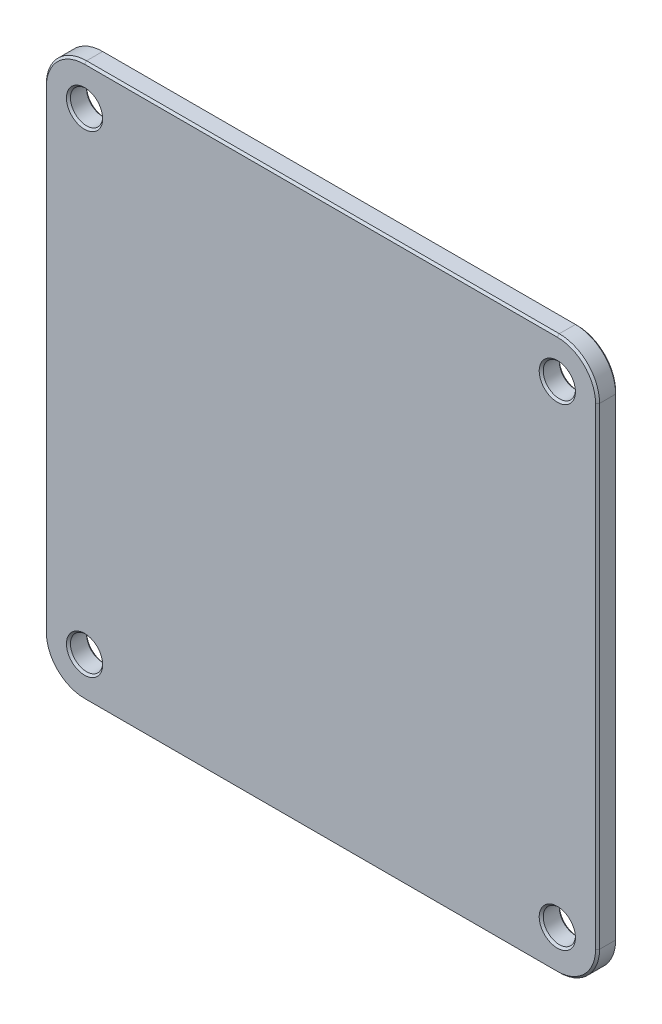
ISO-10303-21;
HEADER;
FILE_DESCRIPTION(('STEP AP214'),'2;1');
FILE_NAME('part.step','',(''),(''),'','','');
FILE_SCHEMA(('AUTOMOTIVE_DESIGN { 1 0 10303 214 1 1 1 1 }'));
ENDSEC;
DATA;
#1=APPLICATION_CONTEXT('core data for automotive mechanical design processes');
#2=APPLICATION_PROTOCOL_DEFINITION('international standard','automotive_design',2000,#1);
#3=PRODUCT_CONTEXT('',#1,'mechanical');
#4=PRODUCT('Part','Part','',(#3));
#5=PRODUCT_RELATED_PRODUCT_CATEGORY('part','',(#4));
#6=PRODUCT_DEFINITION_FORMATION('','',#4);
#7=PRODUCT_DEFINITION_CONTEXT('part definition',#1,'design');
#8=PRODUCT_DEFINITION('design','',#6,#7);
#9=PRODUCT_DEFINITION_SHAPE('','',#8);
#10=(LENGTH_UNIT() NAMED_UNIT(*) SI_UNIT(.MILLI.,.METRE.));
#11=(NAMED_UNIT(*) PLANE_ANGLE_UNIT() SI_UNIT($,.RADIAN.));
#12=(NAMED_UNIT(*) SI_UNIT($,.STERADIAN.) SOLID_ANGLE_UNIT());
#13=UNCERTAINTY_MEASURE_WITH_UNIT(LENGTH_MEASURE(1.E-05),#10,'distance_accuracy_value','');
#14=(GEOMETRIC_REPRESENTATION_CONTEXT(3) GLOBAL_UNCERTAINTY_ASSIGNED_CONTEXT((#13)) GLOBAL_UNIT_ASSIGNED_CONTEXT((#10,
#11,#12)) REPRESENTATION_CONTEXT('',''));
#15=CARTESIAN_POINT('',(0.,0.,0.));
#16=DIRECTION('',(0.,0.,1.));
#17=DIRECTION('',(1.,0.,0.));
#18=AXIS2_PLACEMENT_3D('',#15,#16,#17);
#19=CARTESIAN_POINT('',(-27.5,27.5,2.));
#20=DIRECTION('',(0.,-1.,0.));
#21=DIRECTION('',(0.,0.,-1.));
#22=AXIS2_PLACEMENT_3D('',#19,#20,#21);
#23=PLANE('',#22);
#24=DIRECTION('',(0.,0.,1.));
#25=VECTOR('',#24,1.);
#26=CARTESIAN_POINT('',(-23.5,27.5,0.));
#27=LINE('',#26,#25);
#28=CARTESIAN_POINT('',(-23.5,27.5,0.199999999999999));
#29=VERTEX_POINT('',#28);
#30=CARTESIAN_POINT('',(-23.5,27.5,1.80000000000001));
#31=VERTEX_POINT('',#30);
#32=EDGE_CURVE('E368',#29,#31,#27,.T.);
#33=ORIENTED_EDGE('',*,*,#32,.T.);
#34=DIRECTION('',(1.,0.,0.));
#35=VECTOR('',#34,1.);
#36=CARTESIAN_POINT('',(23.5,27.5,1.80000000000001));
#37=LINE('',#36,#35);
#38=CARTESIAN_POINT('',(23.5,27.5,1.80000000000001));
#39=VERTEX_POINT('',#38);
#40=EDGE_CURVE('E260',#31,#39,#37,.T.);
#41=ORIENTED_EDGE('',*,*,#40,.T.);
#42=DIRECTION('',(0.,0.,1.));
#43=VECTOR('',#42,1.);
#44=CARTESIAN_POINT('',(23.5,27.5,0.));
#45=LINE('',#44,#43);
#46=CARTESIAN_POINT('',(23.5,27.5,0.199999999999999));
#47=VERTEX_POINT('',#46);
#48=EDGE_CURVE('E328',#47,#39,#45,.T.);
#49=ORIENTED_EDGE('',*,*,#48,.F.);
#50=DIRECTION('',(-1.,0.,0.));
#51=VECTOR('',#50,1.);
#52=CARTESIAN_POINT('',(-27.5,27.5,0.199999999999999));
#53=LINE('',#52,#51);
#54=EDGE_CURVE('E194',#47,#29,#53,.T.);
#55=ORIENTED_EDGE('',*,*,#54,.T.);
#56=EDGE_LOOP('',(#33,#41,#49,#55));
#57=FACE_BOUND('',#56,.T.);
#58=ADVANCED_FACE('F35',(#57),#23,.F.);
#59=CARTESIAN_POINT('',(-27.5,27.5,2.));
#60=DIRECTION('',(1.,0.,0.));
#61=DIRECTION('',(0.,0.,-1.));
#62=AXIS2_PLACEMENT_3D('',#59,#60,#61);
#63=PLANE('',#62);
#64=DIRECTION('',(0.,0.,1.));
#65=VECTOR('',#64,1.);
#66=CARTESIAN_POINT('',(-27.5,-23.5,0.));
#67=LINE('',#66,#65);
#68=CARTESIAN_POINT('',(-27.5,-23.5,0.199999999999999));
#69=VERTEX_POINT('',#68);
#70=CARTESIAN_POINT('',(-27.5,-23.5,1.80000000000001));
#71=VERTEX_POINT('',#70);
#72=EDGE_CURVE('E230',#69,#71,#67,.T.);
#73=ORIENTED_EDGE('',*,*,#72,.T.);
#74=DIRECTION('',(0.,1.,0.));
#75=VECTOR('',#74,1.);
#76=CARTESIAN_POINT('',(-27.5,23.5,1.80000000000001));
#77=LINE('',#76,#75);
#78=CARTESIAN_POINT('',(-27.5,23.5,1.80000000000001));
#79=VERTEX_POINT('',#78);
#80=EDGE_CURVE('E52',#71,#79,#77,.T.);
#81=ORIENTED_EDGE('',*,*,#80,.T.);
#82=DIRECTION('',(0.,0.,1.));
#83=VECTOR('',#82,1.);
#84=CARTESIAN_POINT('',(-27.5,23.5,0.));
#85=LINE('',#84,#83);
#86=CARTESIAN_POINT('',(-27.5,23.5,0.199999999999999));
#87=VERTEX_POINT('',#86);
#88=EDGE_CURVE('E335',#87,#79,#85,.T.);
#89=ORIENTED_EDGE('',*,*,#88,.F.);
#90=DIRECTION('',(0.,-1.,0.));
#91=VECTOR('',#90,1.);
#92=CARTESIAN_POINT('',(-27.5,27.5,0.199999999999999));
#93=LINE('',#92,#91);
#94=EDGE_CURVE('E198',#87,#69,#93,.T.);
#95=ORIENTED_EDGE('',*,*,#94,.T.);
#96=EDGE_LOOP('',(#73,#81,#89,#95));
#97=FACE_BOUND('',#96,.T.);
#98=ADVANCED_FACE('F428',(#97),#63,.F.);
#99=CARTESIAN_POINT('',(-27.5,-27.5,2.));
#100=DIRECTION('',(0.,1.,0.));
#101=DIRECTION('',(0.,0.,1.));
#102=AXIS2_PLACEMENT_3D('',#99,#100,#101);
#103=PLANE('',#102);
#104=DIRECTION('',(0.,0.,1.));
#105=VECTOR('',#104,1.);
#106=CARTESIAN_POINT('',(23.5,-27.5,0.));
#107=LINE('',#106,#105);
#108=CARTESIAN_POINT('',(23.5,-27.5,0.199999999999999));
#109=VERTEX_POINT('',#108);
#110=CARTESIAN_POINT('',(23.5,-27.5,1.80000000000001));
#111=VERTEX_POINT('',#110);
#112=EDGE_CURVE('E320',#109,#111,#107,.T.);
#113=ORIENTED_EDGE('',*,*,#112,.T.);
#114=DIRECTION('',(-1.,0.,0.));
#115=VECTOR('',#114,1.);
#116=CARTESIAN_POINT('',(-23.5,-27.5,1.80000000000001));
#117=LINE('',#116,#115);
#118=CARTESIAN_POINT('',(-23.5,-27.5,1.80000000000001));
#119=VERTEX_POINT('',#118);
#120=EDGE_CURVE('E269',#111,#119,#117,.T.);
#121=ORIENTED_EDGE('',*,*,#120,.T.);
#122=DIRECTION('',(0.,0.,1.));
#123=VECTOR('',#122,1.);
#124=CARTESIAN_POINT('',(-23.5,-27.5,0.));
#125=LINE('',#124,#123);
#126=CARTESIAN_POINT('',(-23.5,-27.5,0.199999999999999));
#127=VERTEX_POINT('',#126);
#128=EDGE_CURVE('E318',#127,#119,#125,.T.);
#129=ORIENTED_EDGE('',*,*,#128,.F.);
#130=DIRECTION('',(1.,0.,0.));
#131=VECTOR('',#130,1.);
#132=CARTESIAN_POINT('',(-27.5,-27.5,0.199999999999999));
#133=LINE('',#132,#131);
#134=EDGE_CURVE('E181',#127,#109,#133,.T.);
#135=ORIENTED_EDGE('',*,*,#134,.T.);
#136=EDGE_LOOP('',(#113,#121,#129,#135));
#137=FACE_BOUND('',#136,.T.);
#138=ADVANCED_FACE('F317',(#137),#103,.F.);
#139=CARTESIAN_POINT('',(27.5,27.5,2.));
#140=DIRECTION('',(-1.,0.,0.));
#141=DIRECTION('',(0.,0.,1.));
#142=AXIS2_PLACEMENT_3D('',#139,#140,#141);
#143=PLANE('',#142);
#144=DIRECTION('',(0.,0.,1.));
#145=VECTOR('',#144,1.);
#146=CARTESIAN_POINT('',(27.5,23.5,0.));
#147=LINE('',#146,#145);
#148=CARTESIAN_POINT('',(27.5,23.5,0.199999999999999));
#149=VERTEX_POINT('',#148);
#150=CARTESIAN_POINT('',(27.5,23.5,1.80000000000001));
#151=VERTEX_POINT('',#150);
#152=EDGE_CURVE('E332',#149,#151,#147,.T.);
#153=ORIENTED_EDGE('',*,*,#152,.T.);
#154=DIRECTION('',(0.,-1.,0.));
#155=VECTOR('',#154,1.);
#156=CARTESIAN_POINT('',(27.5,-23.5,1.80000000000001));
#157=LINE('',#156,#155);
#158=CARTESIAN_POINT('',(27.5,-23.5,1.80000000000001));
#159=VERTEX_POINT('',#158);
#160=EDGE_CURVE('E265',#151,#159,#157,.T.);
#161=ORIENTED_EDGE('',*,*,#160,.T.);
#162=DIRECTION('',(0.,0.,1.));
#163=VECTOR('',#162,1.);
#164=CARTESIAN_POINT('',(27.5,-23.5,0.));
#165=LINE('',#164,#163);
#166=CARTESIAN_POINT('',(27.5,-23.5,0.199999999999999));
#167=VERTEX_POINT('',#166);
#168=EDGE_CURVE('E323',#167,#159,#165,.T.);
#169=ORIENTED_EDGE('',*,*,#168,.F.);
#170=DIRECTION('',(0.,1.,0.));
#171=VECTOR('',#170,1.);
#172=CARTESIAN_POINT('',(27.5,27.5,0.199999999999999));
#173=LINE('',#172,#171);
#174=EDGE_CURVE('E190',#167,#149,#173,.T.);
#175=ORIENTED_EDGE('',*,*,#174,.T.);
#176=EDGE_LOOP('',(#153,#161,#169,#175));
#177=FACE_BOUND('',#176,.T.);
#178=ADVANCED_FACE('F405',(#177),#143,.F.);
#179=CARTESIAN_POINT('',(0.,0.,2.));
#180=DIRECTION('',(0.,0.,1.));
#181=DIRECTION('',(1.,0.,0.));
#182=AXIS2_PLACEMENT_3D('',#179,#180,#181);
#183=PLANE('',#182);
#184=CARTESIAN_POINT('',(23.5,23.5,2.));
#185=DIRECTION('',(0.,0.,1.));
#186=DIRECTION('',(1.,0.,0.));
#187=AXIS2_PLACEMENT_3D('',#184,#185,#186);
#188=CIRCLE('',#187,3.8);
#189=CARTESIAN_POINT('',(27.3,23.5,2.));
#190=VERTEX_POINT('',#189);
#191=CARTESIAN_POINT('',(23.5,27.3,2.));
#192=VERTEX_POINT('',#191);
#193=EDGE_CURVE('E255',#190,#192,#188,.T.);
#194=ORIENTED_EDGE('',*,*,#193,.T.);
#195=DIRECTION('',(-1.,0.,0.));
#196=VECTOR('',#195,1.);
#197=CARTESIAN_POINT('',(-23.5,27.3,2.));
#198=LINE('',#197,#196);
#199=CARTESIAN_POINT('',(-23.5,27.3,2.));
#200=VERTEX_POINT('',#199);
#201=EDGE_CURVE('E257',#192,#200,#198,.T.);
#202=ORIENTED_EDGE('',*,*,#201,.T.);
#203=CARTESIAN_POINT('',(-23.5,23.5,2.));
#204=DIRECTION('',(0.,0.,1.));
#205=DIRECTION('',(1.,0.,0.));
#206=AXIS2_PLACEMENT_3D('',#203,#204,#205);
#207=CIRCLE('',#206,3.8);
#208=CARTESIAN_POINT('',(-27.3,23.5,2.));
#209=VERTEX_POINT('',#208);
#210=EDGE_CURVE('E242',#200,#209,#207,.T.);
#211=ORIENTED_EDGE('',*,*,#210,.T.);
#212=DIRECTION('',(0.,-1.,0.));
#213=VECTOR('',#212,1.);
#214=CARTESIAN_POINT('',(-27.3,-23.5,2.));
#215=LINE('',#214,#213);
#216=CARTESIAN_POINT('',(-27.3,-23.5,2.));
#217=VERTEX_POINT('',#216);
#218=EDGE_CURVE('E244',#209,#217,#215,.T.);
#219=ORIENTED_EDGE('',*,*,#218,.T.);
#220=CARTESIAN_POINT('',(-23.5,-23.5,2.));
#221=DIRECTION('',(0.,0.,1.));
#222=DIRECTION('',(1.,0.,0.));
#223=AXIS2_PLACEMENT_3D('',#220,#221,#222);
#224=CIRCLE('',#223,3.79999999999999);
#225=CARTESIAN_POINT('',(-23.5,-27.3,2.));
#226=VERTEX_POINT('',#225);
#227=EDGE_CURVE('E246',#217,#226,#224,.T.);
#228=ORIENTED_EDGE('',*,*,#227,.T.);
#229=DIRECTION('',(1.,0.,0.));
#230=VECTOR('',#229,1.);
#231=CARTESIAN_POINT('',(23.5,-27.3,2.));
#232=LINE('',#231,#230);
#233=CARTESIAN_POINT('',(23.5,-27.3,2.));
#234=VERTEX_POINT('',#233);
#235=EDGE_CURVE('E248',#226,#234,#232,.T.);
#236=ORIENTED_EDGE('',*,*,#235,.T.);
#237=CARTESIAN_POINT('',(23.5,-23.5,2.));
#238=DIRECTION('',(0.,0.,1.));
#239=DIRECTION('',(1.,0.,0.));
#240=AXIS2_PLACEMENT_3D('',#237,#238,#239);
#241=CIRCLE('',#240,3.8);
#242=CARTESIAN_POINT('',(27.3,-23.5,2.));
#243=VERTEX_POINT('',#242);
#244=EDGE_CURVE('E251',#234,#243,#241,.T.);
#245=ORIENTED_EDGE('',*,*,#244,.T.);
#246=DIRECTION('',(0.,1.,0.));
#247=VECTOR('',#246,1.);
#248=CARTESIAN_POINT('',(27.3,23.5,2.));
#249=LINE('',#248,#247);
#250=EDGE_CURVE('E253',#243,#190,#249,.T.);
#251=ORIENTED_EDGE('',*,*,#250,.T.);
#252=EDGE_LOOP('',(#194,#202,#211,#219,#228,#236,#245,#251));
#253=FACE_BOUND('',#252,.T.);
#254=CARTESIAN_POINT('',(23.5,23.5,2.));
#255=DIRECTION('',(0.,0.,1.));
#256=DIRECTION('',(1.,0.,0.));
#257=AXIS2_PLACEMENT_3D('',#254,#255,#256);
#258=CIRCLE('',#257,1.8);
#259=CARTESIAN_POINT('',(25.3,23.5,2.));
#260=VERTEX_POINT('',#259);
#261=EDGE_CURVE('E239',#260,#260,#258,.F.);
#262=ORIENTED_EDGE('',*,*,#261,.T.);
#263=EDGE_LOOP('',(#262));
#264=FACE_BOUND('',#263,.T.);
#265=CARTESIAN_POINT('',(-23.5,-23.5,2.));
#266=DIRECTION('',(0.,0.,1.));
#267=DIRECTION('',(1.,0.,0.));
#268=AXIS2_PLACEMENT_3D('',#265,#266,#267);
#269=CIRCLE('',#268,1.8);
#270=CARTESIAN_POINT('',(-21.7,-23.5,2.));
#271=VERTEX_POINT('',#270);
#272=EDGE_CURVE('E236',#271,#271,#269,.F.);
#273=ORIENTED_EDGE('',*,*,#272,.T.);
#274=EDGE_LOOP('',(#273));
#275=FACE_BOUND('',#274,.T.);
#276=CARTESIAN_POINT('',(23.5,-23.5,2.));
#277=DIRECTION('',(0.,0.,1.));
#278=DIRECTION('',(1.,0.,0.));
#279=AXIS2_PLACEMENT_3D('',#276,#277,#278);
#280=CIRCLE('',#279,1.8);
#281=CARTESIAN_POINT('',(25.3,-23.5,2.));
#282=VERTEX_POINT('',#281);
#283=EDGE_CURVE('E233',#282,#282,#280,.F.);
#284=ORIENTED_EDGE('',*,*,#283,.T.);
#285=EDGE_LOOP('',(#284));
#286=FACE_BOUND('',#285,.T.);
#287=CARTESIAN_POINT('',(-23.5,23.5,2.));
#288=DIRECTION('',(0.,0.,1.));
#289=DIRECTION('',(1.,0.,0.));
#290=AXIS2_PLACEMENT_3D('',#287,#288,#289);
#291=CIRCLE('',#290,1.8);
#292=CARTESIAN_POINT('',(-21.7,23.5,2.));
#293=VERTEX_POINT('',#292);
#294=EDGE_CURVE('E211',#293,#293,#291,.F.);
#295=ORIENTED_EDGE('',*,*,#294,.T.);
#296=EDGE_LOOP('',(#295));
#297=FACE_BOUND('',#296,.T.);
#298=ADVANCED_FACE('F415',(#253,#264,#275,#286,#297),#183,.T.);
#299=CARTESIAN_POINT('',(0.,0.,0.));
#300=DIRECTION('',(0.,0.,1.));
#301=DIRECTION('',(1.,0.,0.));
#302=AXIS2_PLACEMENT_3D('',#299,#300,#301);
#303=PLANE('',#302);
#304=DIRECTION('',(-1.,0.,0.));
#305=VECTOR('',#304,1.);
#306=CARTESIAN_POINT('',(0.,-27.3,0.));
#307=LINE('',#306,#305);
#308=CARTESIAN_POINT('',(23.5,-27.3,0.));
#309=VERTEX_POINT('',#308);
#310=CARTESIAN_POINT('',(-23.5,-27.3,0.));
#311=VERTEX_POINT('',#310);
#312=EDGE_CURVE('E178',#309,#311,#307,.T.);
#313=ORIENTED_EDGE('',*,*,#312,.T.);
#314=CARTESIAN_POINT('',(-23.5,-23.5,0.));
#315=DIRECTION('',(0.,0.,1.));
#316=DIRECTION('',(1.,0.,0.));
#317=AXIS2_PLACEMENT_3D('',#314,#315,#316);
#318=CIRCLE('',#317,3.8);
#319=CARTESIAN_POINT('',(-27.3,-23.5,0.));
#320=VERTEX_POINT('',#319);
#321=EDGE_CURVE('E158',#311,#320,#318,.F.);
#322=ORIENTED_EDGE('',*,*,#321,.T.);
#323=DIRECTION('',(0.,1.,0.));
#324=VECTOR('',#323,1.);
#325=CARTESIAN_POINT('',(-27.3,0.,0.));
#326=LINE('',#325,#324);
#327=CARTESIAN_POINT('',(-27.3,23.5,0.));
#328=VERTEX_POINT('',#327);
#329=EDGE_CURVE('E166',#320,#328,#326,.T.);
#330=ORIENTED_EDGE('',*,*,#329,.T.);
#331=CARTESIAN_POINT('',(-23.5,23.5,0.));
#332=DIRECTION('',(0.,0.,1.));
#333=DIRECTION('',(1.,0.,0.));
#334=AXIS2_PLACEMENT_3D('',#331,#332,#333);
#335=CIRCLE('',#334,3.80000000000001);
#336=CARTESIAN_POINT('',(-23.5,27.3,0.));
#337=VERTEX_POINT('',#336);
#338=EDGE_CURVE('E172',#328,#337,#335,.F.);
#339=ORIENTED_EDGE('',*,*,#338,.T.);
#340=DIRECTION('',(1.,0.,0.));
#341=VECTOR('',#340,1.);
#342=CARTESIAN_POINT('',(0.,27.3,0.));
#343=LINE('',#342,#341);
#344=CARTESIAN_POINT('',(23.5,27.3,0.));
#345=VERTEX_POINT('',#344);
#346=EDGE_CURVE('E347',#337,#345,#343,.T.);
#347=ORIENTED_EDGE('',*,*,#346,.T.);
#348=CARTESIAN_POINT('',(23.5,23.5,0.));
#349=DIRECTION('',(0.,0.,1.));
#350=DIRECTION('',(1.,0.,0.));
#351=AXIS2_PLACEMENT_3D('',#348,#349,#350);
#352=CIRCLE('',#351,3.80000000000001);
#353=CARTESIAN_POINT('',(27.3,23.5,0.));
#354=VERTEX_POINT('',#353);
#355=EDGE_CURVE('E349',#345,#354,#352,.F.);
#356=ORIENTED_EDGE('',*,*,#355,.T.);
#357=DIRECTION('',(0.,-1.,0.));
#358=VECTOR('',#357,1.);
#359=CARTESIAN_POINT('',(27.3,0.,0.));
#360=LINE('',#359,#358);
#361=CARTESIAN_POINT('',(27.3,-23.5,0.));
#362=VERTEX_POINT('',#361);
#363=EDGE_CURVE('E351',#354,#362,#360,.T.);
#364=ORIENTED_EDGE('',*,*,#363,.T.);
#365=CARTESIAN_POINT('',(23.5,-23.5,0.));
#366=DIRECTION('',(0.,0.,1.));
#367=DIRECTION('',(1.,0.,0.));
#368=AXIS2_PLACEMENT_3D('',#365,#366,#367);
#369=CIRCLE('',#368,3.80000000000001);
#370=EDGE_CURVE('E183',#362,#309,#369,.F.);
#371=ORIENTED_EDGE('',*,*,#370,.T.);
#372=EDGE_LOOP('',(#313,#322,#330,#339,#347,#356,#364,#371));
#373=FACE_BOUND('',#372,.T.);
#374=CARTESIAN_POINT('',(23.5,23.5,0.));
#375=DIRECTION('',(0.,0.,1.));
#376=DIRECTION('',(1.,0.,0.));
#377=AXIS2_PLACEMENT_3D('',#374,#375,#376);
#378=CIRCLE('',#377,1.79999999999998);
#379=CARTESIAN_POINT('',(25.3,23.5,0.));
#380=VERTEX_POINT('',#379);
#381=EDGE_CURVE('E173',#380,#380,#378,.T.);
#382=ORIENTED_EDGE('',*,*,#381,.T.);
#383=EDGE_LOOP('',(#382));
#384=FACE_BOUND('',#383,.T.);
#385=CARTESIAN_POINT('',(-23.5,-23.5,0.));
#386=DIRECTION('',(0.,0.,1.));
#387=DIRECTION('',(1.,0.,0.));
#388=AXIS2_PLACEMENT_3D('',#385,#386,#387);
#389=CIRCLE('',#388,1.79999999999998);
#390=CARTESIAN_POINT('',(-21.7,-23.5,0.));
#391=VERTEX_POINT('',#390);
#392=EDGE_CURVE('E341',#391,#391,#389,.T.);
#393=ORIENTED_EDGE('',*,*,#392,.T.);
#394=EDGE_LOOP('',(#393));
#395=FACE_BOUND('',#394,.T.);
#396=CARTESIAN_POINT('',(23.5,-23.5,0.));
#397=DIRECTION('',(0.,0.,1.));
#398=DIRECTION('',(1.,0.,0.));
#399=AXIS2_PLACEMENT_3D('',#396,#397,#398);
#400=CIRCLE('',#399,1.80000000000001);
#401=CARTESIAN_POINT('',(25.3,-23.5,0.));
#402=VERTEX_POINT('',#401);
#403=EDGE_CURVE('E338',#402,#402,#400,.T.);
#404=ORIENTED_EDGE('',*,*,#403,.T.);
#405=EDGE_LOOP('',(#404));
#406=FACE_BOUND('',#405,.T.);
#407=CARTESIAN_POINT('',(-23.5,23.5,0.));
#408=DIRECTION('',(0.,0.,1.));
#409=DIRECTION('',(1.,0.,0.));
#410=AXIS2_PLACEMENT_3D('',#407,#408,#409);
#411=CIRCLE('',#410,1.79999999999999);
#412=CARTESIAN_POINT('',(-21.7,23.5,0.));
#413=VERTEX_POINT('',#412);
#414=EDGE_CURVE('E331',#413,#413,#411,.T.);
#415=ORIENTED_EDGE('',*,*,#414,.T.);
#416=EDGE_LOOP('',(#415));
#417=FACE_BOUND('',#416,.T.);
#418=ADVANCED_FACE('F175',(#373,#384,#395,#406,#417),#303,.F.);
#419=CARTESIAN_POINT('',(23.5,23.5,0.));
#420=DIRECTION('',(0.,0.,1.));
#421=DIRECTION('',(1.,0.,0.));
#422=AXIS2_PLACEMENT_3D('',#419,#420,#421);
#423=CYLINDRICAL_SURFACE('',#422,4.);
#424=ORIENTED_EDGE('',*,*,#48,.T.);
#425=CARTESIAN_POINT('',(23.5,23.5,1.80000000000001));
#426=DIRECTION('',(0.,0.,1.));
#427=DIRECTION('',(1.,0.,0.));
#428=AXIS2_PLACEMENT_3D('',#425,#426,#427);
#429=CIRCLE('',#428,4.);
#430=EDGE_CURVE('E263',#39,#151,#429,.F.);
#431=ORIENTED_EDGE('',*,*,#430,.T.);
#432=ORIENTED_EDGE('',*,*,#152,.F.);
#433=CARTESIAN_POINT('',(23.5,23.5,0.199999999999999));
#434=DIRECTION('',(0.,0.,1.));
#435=DIRECTION('',(1.,0.,0.));
#436=AXIS2_PLACEMENT_3D('',#433,#434,#435);
#437=CIRCLE('',#436,4.);
#438=EDGE_CURVE('E192',#149,#47,#437,.T.);
#439=ORIENTED_EDGE('',*,*,#438,.T.);
#440=EDGE_LOOP('',(#424,#431,#432,#439));
#441=FACE_BOUND('',#440,.T.);
#442=ADVANCED_FACE('F395',(#441),#423,.T.);
#443=CARTESIAN_POINT('',(-23.5,-23.5,0.));
#444=DIRECTION('',(0.,0.,1.));
#445=DIRECTION('',(1.,0.,0.));
#446=AXIS2_PLACEMENT_3D('',#443,#444,#445);
#447=CYLINDRICAL_SURFACE('',#446,3.99999999999999);
#448=ORIENTED_EDGE('',*,*,#128,.T.);
#449=CARTESIAN_POINT('',(-23.5,-23.5,1.80000000000001));
#450=DIRECTION('',(0.,0.,1.));
#451=DIRECTION('',(1.,0.,0.));
#452=AXIS2_PLACEMENT_3D('',#449,#450,#451);
#453=CIRCLE('',#452,3.99999999999999);
#454=EDGE_CURVE('E60',#119,#71,#453,.F.);
#455=ORIENTED_EDGE('',*,*,#454,.T.);
#456=ORIENTED_EDGE('',*,*,#72,.F.);
#457=CARTESIAN_POINT('',(-23.5,-23.5,0.199999999999999));
#458=DIRECTION('',(0.,0.,1.));
#459=DIRECTION('',(1.,0.,0.));
#460=AXIS2_PLACEMENT_3D('',#457,#458,#459);
#461=CIRCLE('',#460,3.99999999999999);
#462=EDGE_CURVE('E160',#69,#127,#461,.T.);
#463=ORIENTED_EDGE('',*,*,#462,.T.);
#464=EDGE_LOOP('',(#448,#455,#456,#463));
#465=FACE_BOUND('',#464,.T.);
#466=ADVANCED_FACE('F321',(#465),#447,.T.);
#467=CARTESIAN_POINT('',(23.5,-23.5,0.));
#468=DIRECTION('',(0.,0.,1.));
#469=DIRECTION('',(1.,0.,0.));
#470=AXIS2_PLACEMENT_3D('',#467,#468,#469);
#471=CYLINDRICAL_SURFACE('',#470,4.);
#472=ORIENTED_EDGE('',*,*,#168,.T.);
#473=CARTESIAN_POINT('',(23.5,-23.5,1.80000000000001));
#474=DIRECTION('',(0.,0.,1.));
#475=DIRECTION('',(1.,0.,0.));
#476=AXIS2_PLACEMENT_3D('',#473,#474,#475);
#477=CIRCLE('',#476,4.);
#478=EDGE_CURVE('E267',#159,#111,#477,.F.);
#479=ORIENTED_EDGE('',*,*,#478,.T.);
#480=ORIENTED_EDGE('',*,*,#112,.F.);
#481=CARTESIAN_POINT('',(23.5,-23.5,0.199999999999999));
#482=DIRECTION('',(0.,0.,1.));
#483=DIRECTION('',(1.,0.,0.));
#484=AXIS2_PLACEMENT_3D('',#481,#482,#483);
#485=CIRCLE('',#484,4.);
#486=EDGE_CURVE('E188',#109,#167,#485,.T.);
#487=ORIENTED_EDGE('',*,*,#486,.T.);
#488=EDGE_LOOP('',(#472,#479,#480,#487));
#489=FACE_BOUND('',#488,.T.);
#490=ADVANCED_FACE('F364',(#489),#471,.T.);
#491=CARTESIAN_POINT('',(-23.5,23.5,0.));
#492=DIRECTION('',(0.,0.,1.));
#493=DIRECTION('',(1.,0.,0.));
#494=AXIS2_PLACEMENT_3D('',#491,#492,#493);
#495=CYLINDRICAL_SURFACE('',#494,4.);
#496=ORIENTED_EDGE('',*,*,#88,.T.);
#497=CARTESIAN_POINT('',(-23.5,23.5,1.80000000000001));
#498=DIRECTION('',(0.,0.,1.));
#499=DIRECTION('',(1.,0.,0.));
#500=AXIS2_PLACEMENT_3D('',#497,#498,#499);
#501=CIRCLE('',#500,4.);
#502=EDGE_CURVE('E273',#79,#31,#501,.F.);
#503=ORIENTED_EDGE('',*,*,#502,.T.);
#504=ORIENTED_EDGE('',*,*,#32,.F.);
#505=CARTESIAN_POINT('',(-23.5,23.5,0.199999999999999));
#506=DIRECTION('',(0.,0.,1.));
#507=DIRECTION('',(1.,0.,0.));
#508=AXIS2_PLACEMENT_3D('',#505,#506,#507);
#509=CIRCLE('',#508,4.);
#510=EDGE_CURVE('E196',#29,#87,#509,.T.);
#511=ORIENTED_EDGE('',*,*,#510,.T.);
#512=EDGE_LOOP('',(#496,#503,#504,#511));
#513=FACE_BOUND('',#512,.T.);
#514=ADVANCED_FACE('F374',(#513),#495,.T.);
#515=CARTESIAN_POINT('',(23.5,23.5,0.));
#516=DIRECTION('',(0.,0.,1.));
#517=DIRECTION('',(1.,0.,0.));
#518=AXIS2_PLACEMENT_3D('',#515,#516,#517);
#519=CYLINDRICAL_SURFACE('',#518,1.6);
#520=CARTESIAN_POINT('',(23.5,23.5,1.80000000000001));
#521=DIRECTION('',(0.,0.,1.));
#522=DIRECTION('',(1.,0.,0.));
#523=AXIS2_PLACEMENT_3D('',#520,#521,#522);
#524=CIRCLE('',#523,1.6);
#525=CARTESIAN_POINT('',(25.1,23.5,1.80000000000001));
#526=VERTEX_POINT('',#525);
#527=EDGE_CURVE('E275',#526,#526,#524,.T.);
#528=ORIENTED_EDGE('',*,*,#527,.T.);
#529=EDGE_LOOP('',(#528));
#530=FACE_BOUND('',#529,.T.);
#531=CARTESIAN_POINT('',(23.5,23.5,0.199999999999979));
#532=DIRECTION('',(0.,0.,1.));
#533=DIRECTION('',(1.,0.,0.));
#534=AXIS2_PLACEMENT_3D('',#531,#532,#533);
#535=CIRCLE('',#534,1.6);
#536=CARTESIAN_POINT('',(25.1,23.5,0.199999999999979));
#537=VERTEX_POINT('',#536);
#538=EDGE_CURVE('E200',#537,#537,#535,.F.);
#539=ORIENTED_EDGE('',*,*,#538,.T.);
#540=EDGE_LOOP('',(#539));
#541=FACE_BOUND('',#540,.T.);
#542=ADVANCED_FACE('F650',(#530,#541),#519,.F.);
#543=CARTESIAN_POINT('',(-23.5,-23.5,0.));
#544=DIRECTION('',(0.,0.,1.));
#545=DIRECTION('',(1.,0.,0.));
#546=AXIS2_PLACEMENT_3D('',#543,#544,#545);
#547=CYLINDRICAL_SURFACE('',#546,1.6);
#548=CARTESIAN_POINT('',(-23.5,-23.5,1.80000000000001));
#549=DIRECTION('',(0.,0.,1.));
#550=DIRECTION('',(1.,0.,0.));
#551=AXIS2_PLACEMENT_3D('',#548,#549,#550);
#552=CIRCLE('',#551,1.6);
#553=CARTESIAN_POINT('',(-21.9,-23.5,1.80000000000001));
#554=VERTEX_POINT('',#553);
#555=EDGE_CURVE('E278',#554,#554,#552,.T.);
#556=ORIENTED_EDGE('',*,*,#555,.T.);
#557=EDGE_LOOP('',(#556));
#558=FACE_BOUND('',#557,.T.);
#559=CARTESIAN_POINT('',(-23.5,-23.5,0.199999999999977));
#560=DIRECTION('',(0.,0.,1.));
#561=DIRECTION('',(1.,0.,0.));
#562=AXIS2_PLACEMENT_3D('',#559,#560,#561);
#563=CIRCLE('',#562,1.6);
#564=CARTESIAN_POINT('',(-21.9,-23.5,0.199999999999977));
#565=VERTEX_POINT('',#564);
#566=EDGE_CURVE('E203',#565,#565,#563,.F.);
#567=ORIENTED_EDGE('',*,*,#566,.T.);
#568=EDGE_LOOP('',(#567));
#569=FACE_BOUND('',#568,.T.);
#570=ADVANCED_FACE('F641',(#558,#569),#547,.F.);
#571=CARTESIAN_POINT('',(23.5,-23.5,0.));
#572=DIRECTION('',(0.,0.,1.));
#573=DIRECTION('',(1.,0.,0.));
#574=AXIS2_PLACEMENT_3D('',#571,#572,#573);
#575=CYLINDRICAL_SURFACE('',#574,1.60000000000001);
#576=CARTESIAN_POINT('',(23.5,-23.5,1.80000000000001));
#577=DIRECTION('',(0.,0.,1.));
#578=DIRECTION('',(1.,0.,0.));
#579=AXIS2_PLACEMENT_3D('',#576,#577,#578);
#580=CIRCLE('',#579,1.60000000000001);
#581=CARTESIAN_POINT('',(25.1,-23.5,1.80000000000001));
#582=VERTEX_POINT('',#581);
#583=EDGE_CURVE('E44',#582,#582,#580,.T.);
#584=ORIENTED_EDGE('',*,*,#583,.T.);
#585=EDGE_LOOP('',(#584));
#586=FACE_BOUND('',#585,.T.);
#587=CARTESIAN_POINT('',(23.5,-23.5,0.2));
#588=DIRECTION('',(0.,0.,1.));
#589=DIRECTION('',(1.,0.,0.));
#590=AXIS2_PLACEMENT_3D('',#587,#588,#589);
#591=CIRCLE('',#590,1.60000000000001);
#592=CARTESIAN_POINT('',(25.1,-23.5,0.2));
#593=VERTEX_POINT('',#592);
#594=EDGE_CURVE('E206',#593,#593,#591,.F.);
#595=ORIENTED_EDGE('',*,*,#594,.T.);
#596=EDGE_LOOP('',(#595));
#597=FACE_BOUND('',#596,.T.);
#598=ADVANCED_FACE('F632',(#586,#597),#575,.F.);
#599=CARTESIAN_POINT('',(-23.5,23.5,0.));
#600=DIRECTION('',(0.,0.,1.));
#601=DIRECTION('',(1.,0.,0.));
#602=AXIS2_PLACEMENT_3D('',#599,#600,#601);
#603=CYLINDRICAL_SURFACE('',#602,1.6);
#604=CARTESIAN_POINT('',(-23.5,23.5,1.8));
#605=DIRECTION('',(0.,0.,1.));
#606=DIRECTION('',(1.,0.,0.));
#607=AXIS2_PLACEMENT_3D('',#604,#605,#606);
#608=CIRCLE('',#607,1.6);
#609=CARTESIAN_POINT('',(-21.9,23.5,1.8));
#610=VERTEX_POINT('',#609);
#611=EDGE_CURVE('E11',#610,#610,#608,.T.);
#612=ORIENTED_EDGE('',*,*,#611,.T.);
#613=EDGE_LOOP('',(#612));
#614=FACE_BOUND('',#613,.T.);
#615=CARTESIAN_POINT('',(-23.5,23.5,0.199999999999987));
#616=DIRECTION('',(0.,0.,1.));
#617=DIRECTION('',(1.,0.,0.));
#618=AXIS2_PLACEMENT_3D('',#615,#616,#617);
#619=CIRCLE('',#618,1.6);
#620=CARTESIAN_POINT('',(-21.9,23.5,0.199999999999987));
#621=VERTEX_POINT('',#620);
#622=EDGE_CURVE('E209',#621,#621,#619,.F.);
#623=ORIENTED_EDGE('',*,*,#622,.T.);
#624=EDGE_LOOP('',(#623));
#625=FACE_BOUND('',#624,.T.);
#626=ADVANCED_FACE('F459',(#614,#625),#603,.F.);
#627=CARTESIAN_POINT('',(23.5,23.5,0.));
#628=DIRECTION('',(0.,0.,1.));
#629=DIRECTION('',(1.,0.,0.));
#630=AXIS2_PLACEMENT_3D('',#627,#628,#629);
#631=CONICAL_SURFACE('',#630,3.80000000000001,0.785398163397431);
#632=DIRECTION('',(0.,-0.707106781186535,-0.70710678118656));
#633=VECTOR('',#632,1.);
#634=CARTESIAN_POINT('',(23.5,27.5,0.199999999999999));
#635=LINE('',#634,#633);
#636=EDGE_CURVE('E224',#47,#345,#635,.T.);
#637=ORIENTED_EDGE('',*,*,#636,.F.);
#638=ORIENTED_EDGE('',*,*,#438,.F.);
#639=DIRECTION('',(0.707106781186535,0.,0.70710678118656));
#640=VECTOR('',#639,1.);
#641=CARTESIAN_POINT('',(27.3,23.5,0.));
#642=LINE('',#641,#640);
#643=EDGE_CURVE('E227',#354,#149,#642,.T.);
#644=ORIENTED_EDGE('',*,*,#643,.F.);
#645=ORIENTED_EDGE('',*,*,#355,.F.);
#646=EDGE_LOOP('',(#637,#638,#644,#645));
#647=FACE_BOUND('',#646,.T.);
#648=ADVANCED_FACE('F400',(#647),#631,.T.);
#649=CARTESIAN_POINT('',(27.5,27.5,0.199999999999999));
#650=DIRECTION('',(-0.70710678118656,0.,0.707106781186535));
#651=DIRECTION('',(0.,1.,0.));
#652=AXIS2_PLACEMENT_3D('',#649,#650,#651);
#653=PLANE('',#652);
#654=ORIENTED_EDGE('',*,*,#643,.T.);
#655=ORIENTED_EDGE('',*,*,#174,.F.);
#656=DIRECTION('',(0.707106781186535,0.,0.70710678118656));
#657=VECTOR('',#656,1.);
#658=CARTESIAN_POINT('',(27.3,-23.5,0.));
#659=LINE('',#658,#657);
#660=EDGE_CURVE('E221',#362,#167,#659,.T.);
#661=ORIENTED_EDGE('',*,*,#660,.F.);
#662=ORIENTED_EDGE('',*,*,#363,.F.);
#663=EDGE_LOOP('',(#654,#655,#661,#662));
#664=FACE_BOUND('',#663,.T.);
#665=ADVANCED_FACE('F404',(#664),#653,.F.);
#666=CARTESIAN_POINT('',(-27.5,27.5,0.199999999999999));
#667=DIRECTION('',(0.,-0.70710678118656,0.707106781186535));
#668=DIRECTION('',(-1.,0.,0.));
#669=AXIS2_PLACEMENT_3D('',#666,#667,#668);
#670=PLANE('',#669);
#671=ORIENTED_EDGE('',*,*,#636,.T.);
#672=ORIENTED_EDGE('',*,*,#346,.F.);
#673=DIRECTION('',(0.,-0.707106781186535,-0.70710678118656));
#674=VECTOR('',#673,1.);
#675=CARTESIAN_POINT('',(-23.5,27.5,0.199999999999999));
#676=LINE('',#675,#674);
#677=EDGE_CURVE('E218',#29,#337,#676,.T.);
#678=ORIENTED_EDGE('',*,*,#677,.F.);
#679=ORIENTED_EDGE('',*,*,#54,.F.);
#680=EDGE_LOOP('',(#671,#672,#678,#679));
#681=FACE_BOUND('',#680,.T.);
#682=ADVANCED_FACE('F451',(#681),#670,.F.);
#683=CARTESIAN_POINT('',(23.5,-23.5,0.));
#684=DIRECTION('',(0.,0.,1.));
#685=DIRECTION('',(1.,0.,0.));
#686=AXIS2_PLACEMENT_3D('',#683,#684,#685);
#687=CONICAL_SURFACE('',#686,3.80000000000001,0.785398163397427);
#688=ORIENTED_EDGE('',*,*,#660,.T.);
#689=ORIENTED_EDGE('',*,*,#486,.F.);
#690=DIRECTION('',(0.,-0.707106781186529,0.707106781186566));
#691=VECTOR('',#690,1.);
#692=CARTESIAN_POINT('',(23.5,-27.3,0.));
#693=LINE('',#692,#691);
#694=EDGE_CURVE('E215',#309,#109,#693,.T.);
#695=ORIENTED_EDGE('',*,*,#694,.F.);
#696=ORIENTED_EDGE('',*,*,#370,.F.);
#697=EDGE_LOOP('',(#688,#689,#695,#696));
#698=FACE_BOUND('',#697,.T.);
#699=ADVANCED_FACE('F358',(#698),#687,.T.);
#700=CARTESIAN_POINT('',(-23.5,23.5,0.));
#701=DIRECTION('',(0.,0.,1.));
#702=DIRECTION('',(1.,0.,0.));
#703=AXIS2_PLACEMENT_3D('',#700,#701,#702);
#704=CONICAL_SURFACE('',#703,3.80000000000001,0.785398163397431);
#705=ORIENTED_EDGE('',*,*,#677,.T.);
#706=ORIENTED_EDGE('',*,*,#338,.F.);
#707=DIRECTION('',(0.707106781186535,0.,-0.70710678118656));
#708=VECTOR('',#707,1.);
#709=CARTESIAN_POINT('',(-27.5,23.5,0.199999999999999));
#710=LINE('',#709,#708);
#711=EDGE_CURVE('E169',#87,#328,#710,.T.);
#712=ORIENTED_EDGE('',*,*,#711,.F.);
#713=ORIENTED_EDGE('',*,*,#510,.F.);
#714=EDGE_LOOP('',(#705,#706,#712,#713));
#715=FACE_BOUND('',#714,.T.);
#716=ADVANCED_FACE('F445',(#715),#704,.T.);
#717=CARTESIAN_POINT('',(-27.5,-27.5,0.199999999999999));
#718=DIRECTION('',(0.,0.70710678118656,0.707106781186535));
#719=DIRECTION('',(1.,0.,0.));
#720=AXIS2_PLACEMENT_3D('',#717,#718,#719);
#721=PLANE('',#720);
#722=ORIENTED_EDGE('',*,*,#694,.T.);
#723=ORIENTED_EDGE('',*,*,#134,.F.);
#724=DIRECTION('',(0.,-0.707106781186535,0.70710678118656));
#725=VECTOR('',#724,1.);
#726=CARTESIAN_POINT('',(-23.5,-27.3,0.));
#727=LINE('',#726,#725);
#728=EDGE_CURVE('E163',#311,#127,#727,.T.);
#729=ORIENTED_EDGE('',*,*,#728,.F.);
#730=ORIENTED_EDGE('',*,*,#312,.F.);
#731=EDGE_LOOP('',(#722,#723,#729,#730));
#732=FACE_BOUND('',#731,.T.);
#733=ADVANCED_FACE('F361',(#732),#721,.F.);
#734=CARTESIAN_POINT('',(-27.5,27.5,0.199999999999999));
#735=DIRECTION('',(0.70710678118656,0.,0.707106781186535));
#736=DIRECTION('',(0.,-1.,0.));
#737=AXIS2_PLACEMENT_3D('',#734,#735,#736);
#738=PLANE('',#737);
#739=ORIENTED_EDGE('',*,*,#711,.T.);
#740=ORIENTED_EDGE('',*,*,#329,.F.);
#741=DIRECTION('',(0.707106781186535,0.,-0.70710678118656));
#742=VECTOR('',#741,1.);
#743=CARTESIAN_POINT('',(-27.5,-23.5,0.199999999999999));
#744=LINE('',#743,#742);
#745=EDGE_CURVE('E154',#69,#320,#744,.T.);
#746=ORIENTED_EDGE('',*,*,#745,.F.);
#747=ORIENTED_EDGE('',*,*,#94,.F.);
#748=EDGE_LOOP('',(#739,#740,#746,#747));
#749=FACE_BOUND('',#748,.T.);
#750=ADVANCED_FACE('F167',(#749),#738,.F.);
#751=CARTESIAN_POINT('',(-23.5,-23.5,0.));
#752=DIRECTION('',(0.,0.,1.));
#753=DIRECTION('',(1.,0.,0.));
#754=AXIS2_PLACEMENT_3D('',#751,#752,#753);
#755=CONICAL_SURFACE('',#754,3.8,0.785398163397431);
#756=ORIENTED_EDGE('',*,*,#728,.T.);
#757=ORIENTED_EDGE('',*,*,#462,.F.);
#758=ORIENTED_EDGE('',*,*,#745,.T.);
#759=ORIENTED_EDGE('',*,*,#321,.F.);
#760=EDGE_LOOP('',(#756,#757,#758,#759));
#761=FACE_BOUND('',#760,.T.);
#762=ADVANCED_FACE('F156',(#761),#755,.T.);
#763=CARTESIAN_POINT('',(23.5,23.5,0.));
#764=DIRECTION('',(0.,0.,-1.));
#765=DIRECTION('',(-1.,0.,0.));
#766=AXIS2_PLACEMENT_3D('',#763,#764,#765);
#767=CONICAL_SURFACE('',#766,1.79999999999998,0.785398163397434);
#768=ORIENTED_EDGE('',*,*,#538,.F.);
#769=EDGE_LOOP('',(#768));
#770=FACE_BOUND('',#769,.T.);
#771=ORIENTED_EDGE('',*,*,#381,.F.);
#772=EDGE_LOOP('',(#771));
#773=FACE_BOUND('',#772,.T.);
#774=ADVANCED_FACE('F440',(#770,#773),#767,.F.);
#775=CARTESIAN_POINT('',(-23.5,-23.5,0.));
#776=DIRECTION('',(0.,0.,-1.));
#777=DIRECTION('',(-1.,0.,0.));
#778=AXIS2_PLACEMENT_3D('',#775,#776,#777);
#779=CONICAL_SURFACE('',#778,1.79999999999998,0.785398163397435);
#780=ORIENTED_EDGE('',*,*,#566,.F.);
#781=EDGE_LOOP('',(#780));
#782=FACE_BOUND('',#781,.T.);
#783=ORIENTED_EDGE('',*,*,#392,.F.);
#784=EDGE_LOOP('',(#783));
#785=FACE_BOUND('',#784,.T.);
#786=ADVANCED_FACE('F462',(#782,#785),#779,.F.);
#787=CARTESIAN_POINT('',(23.5,-23.5,0.));
#788=DIRECTION('',(0.,0.,-1.));
#789=DIRECTION('',(-1.,0.,0.));
#790=AXIS2_PLACEMENT_3D('',#787,#788,#789);
#791=CONICAL_SURFACE('',#790,1.80000000000001,0.785398163397452);
#792=ORIENTED_EDGE('',*,*,#594,.F.);
#793=EDGE_LOOP('',(#792));
#794=FACE_BOUND('',#793,.T.);
#795=ORIENTED_EDGE('',*,*,#403,.F.);
#796=EDGE_LOOP('',(#795));
#797=FACE_BOUND('',#796,.T.);
#798=ADVANCED_FACE('F466',(#794,#797),#791,.F.);
#799=CARTESIAN_POINT('',(-23.5,23.5,0.));
#800=DIRECTION('',(0.,0.,-1.));
#801=DIRECTION('',(-1.,0.,0.));
#802=AXIS2_PLACEMENT_3D('',#799,#800,#801);
#803=CONICAL_SURFACE('',#802,1.79999999999999,0.785398163397453);
#804=ORIENTED_EDGE('',*,*,#622,.F.);
#805=EDGE_LOOP('',(#804));
#806=FACE_BOUND('',#805,.T.);
#807=ORIENTED_EDGE('',*,*,#414,.F.);
#808=EDGE_LOOP('',(#807));
#809=FACE_BOUND('',#808,.T.);
#810=ADVANCED_FACE('F470',(#806,#809),#803,.F.);
#811=CARTESIAN_POINT('',(0.,-27.3,2.));
#812=DIRECTION('',(0.,-0.70710678118654,0.707106781186555));
#813=DIRECTION('',(-1.,0.,0.));
#814=AXIS2_PLACEMENT_3D('',#811,#812,#813);
#815=PLANE('',#814);
#816=DIRECTION('',(0.,0.707106781186555,0.70710678118654));
#817=VECTOR('',#816,1.);
#818=CARTESIAN_POINT('',(-23.5,-27.5,1.80000000000001));
#819=LINE('',#818,#817);
#820=EDGE_CURVE('E298',#119,#226,#819,.T.);
#821=ORIENTED_EDGE('',*,*,#820,.F.);
#822=ORIENTED_EDGE('',*,*,#120,.F.);
#823=DIRECTION('',(0.,-0.707106781186555,-0.70710678118654));
#824=VECTOR('',#823,1.);
#825=CARTESIAN_POINT('',(23.5,-27.3,2.));
#826=LINE('',#825,#824);
#827=EDGE_CURVE('E39',#234,#111,#826,.T.);
#828=ORIENTED_EDGE('',*,*,#827,.F.);
#829=ORIENTED_EDGE('',*,*,#235,.F.);
#830=EDGE_LOOP('',(#821,#822,#828,#829));
#831=FACE_BOUND('',#830,.T.);
#832=ADVANCED_FACE('F313',(#831),#815,.T.);
#833=CARTESIAN_POINT('',(23.5,-23.5,1.80000000000001));
#834=DIRECTION('',(0.,0.,-1.));
#835=DIRECTION('',(-1.,0.,0.));
#836=AXIS2_PLACEMENT_3D('',#833,#834,#835);
#837=CONICAL_SURFACE('',#836,4.,0.785398163397463);
#838=ORIENTED_EDGE('',*,*,#827,.T.);
#839=ORIENTED_EDGE('',*,*,#478,.F.);
#840=DIRECTION('',(0.707106781186555,0.,-0.70710678118654));
#841=VECTOR('',#840,1.);
#842=CARTESIAN_POINT('',(27.3,-23.5,2.));
#843=LINE('',#842,#841);
#844=EDGE_CURVE('E296',#243,#159,#843,.T.);
#845=ORIENTED_EDGE('',*,*,#844,.F.);
#846=ORIENTED_EDGE('',*,*,#244,.F.);
#847=EDGE_LOOP('',(#838,#839,#845,#846));
#848=FACE_BOUND('',#847,.T.);
#849=ADVANCED_FACE('F308',(#848),#837,.T.);
#850=CARTESIAN_POINT('',(-23.5,-23.5,1.80000000000001));
#851=DIRECTION('',(0.,0.,-1.));
#852=DIRECTION('',(-1.,0.,0.));
#853=AXIS2_PLACEMENT_3D('',#850,#851,#852);
#854=CONICAL_SURFACE('',#853,3.99999999999999,0.785398163397459);
#855=ORIENTED_EDGE('',*,*,#820,.T.);
#856=ORIENTED_EDGE('',*,*,#227,.F.);
#857=DIRECTION('',(0.707106781186555,0.,0.70710678118654));
#858=VECTOR('',#857,1.);
#859=CARTESIAN_POINT('',(-27.5,-23.5,1.80000000000001));
#860=LINE('',#859,#858);
#861=EDGE_CURVE('E293',#71,#217,#860,.T.);
#862=ORIENTED_EDGE('',*,*,#861,.F.);
#863=ORIENTED_EDGE('',*,*,#454,.F.);
#864=EDGE_LOOP('',(#855,#856,#862,#863));
#865=FACE_BOUND('',#864,.T.);
#866=ADVANCED_FACE('F418',(#865),#854,.T.);
#867=CARTESIAN_POINT('',(27.3,0.,2.));
#868=DIRECTION('',(0.70710678118654,0.,0.707106781186555));
#869=DIRECTION('',(0.,-1.,0.));
#870=AXIS2_PLACEMENT_3D('',#867,#868,#869);
#871=PLANE('',#870);
#872=ORIENTED_EDGE('',*,*,#844,.T.);
#873=ORIENTED_EDGE('',*,*,#160,.F.);
#874=DIRECTION('',(0.707106781186555,0.,-0.70710678118654));
#875=VECTOR('',#874,1.);
#876=CARTESIAN_POINT('',(27.3,23.5,2.));
#877=LINE('',#876,#875);
#878=EDGE_CURVE('E290',#190,#151,#877,.T.);
#879=ORIENTED_EDGE('',*,*,#878,.F.);
#880=ORIENTED_EDGE('',*,*,#250,.F.);
#881=EDGE_LOOP('',(#872,#873,#879,#880));
#882=FACE_BOUND('',#881,.T.);
#883=ADVANCED_FACE('F409',(#882),#871,.T.);
#884=CARTESIAN_POINT('',(-27.3,0.,2.));
#885=DIRECTION('',(-0.70710678118654,0.,0.707106781186555));
#886=DIRECTION('',(0.,1.,0.));
#887=AXIS2_PLACEMENT_3D('',#884,#885,#886);
#888=PLANE('',#887);
#889=ORIENTED_EDGE('',*,*,#861,.T.);
#890=ORIENTED_EDGE('',*,*,#218,.F.);
#891=DIRECTION('',(0.707106781186555,0.,0.70710678118654));
#892=VECTOR('',#891,1.);
#893=CARTESIAN_POINT('',(-27.5,23.5,1.80000000000001));
#894=LINE('',#893,#892);
#895=EDGE_CURVE('E287',#79,#209,#894,.T.);
#896=ORIENTED_EDGE('',*,*,#895,.F.);
#897=ORIENTED_EDGE('',*,*,#80,.F.);
#898=EDGE_LOOP('',(#889,#890,#896,#897));
#899=FACE_BOUND('',#898,.T.);
#900=ADVANCED_FACE('F380',(#899),#888,.T.);
#901=CARTESIAN_POINT('',(23.5,23.5,1.80000000000001));
#902=DIRECTION('',(0.,0.,-1.));
#903=DIRECTION('',(-1.,0.,0.));
#904=AXIS2_PLACEMENT_3D('',#901,#902,#903);
#905=CONICAL_SURFACE('',#904,4.,0.785398163397459);
#906=ORIENTED_EDGE('',*,*,#878,.T.);
#907=ORIENTED_EDGE('',*,*,#430,.F.);
#908=DIRECTION('',(0.,0.707106781186555,-0.70710678118654));
#909=VECTOR('',#908,1.);
#910=CARTESIAN_POINT('',(23.5,27.3,2.));
#911=LINE('',#910,#909);
#912=EDGE_CURVE('E285',#192,#39,#911,.T.);
#913=ORIENTED_EDGE('',*,*,#912,.F.);
#914=ORIENTED_EDGE('',*,*,#193,.F.);
#915=EDGE_LOOP('',(#906,#907,#913,#914));
#916=FACE_BOUND('',#915,.T.);
#917=ADVANCED_FACE('F413',(#916),#905,.T.);
#918=CARTESIAN_POINT('',(-23.5,23.5,1.80000000000001));
#919=DIRECTION('',(0.,0.,-1.));
#920=DIRECTION('',(-1.,0.,0.));
#921=AXIS2_PLACEMENT_3D('',#918,#919,#920);
#922=CONICAL_SURFACE('',#921,4.,0.785398163397459);
#923=ORIENTED_EDGE('',*,*,#895,.T.);
#924=ORIENTED_EDGE('',*,*,#210,.F.);
#925=DIRECTION('',(0.,-0.707106781186555,0.70710678118654));
#926=VECTOR('',#925,1.);
#927=CARTESIAN_POINT('',(-23.5,27.5,1.80000000000001));
#928=LINE('',#927,#926);
#929=EDGE_CURVE('E283',#31,#200,#928,.T.);
#930=ORIENTED_EDGE('',*,*,#929,.F.);
#931=ORIENTED_EDGE('',*,*,#502,.F.);
#932=EDGE_LOOP('',(#923,#924,#930,#931));
#933=FACE_BOUND('',#932,.T.);
#934=ADVANCED_FACE('F384',(#933),#922,.T.);
#935=CARTESIAN_POINT('',(0.,27.3,2.));
#936=DIRECTION('',(0.,0.70710678118654,0.707106781186555));
#937=DIRECTION('',(1.,0.,0.));
#938=AXIS2_PLACEMENT_3D('',#935,#936,#937);
#939=PLANE('',#938);
#940=ORIENTED_EDGE('',*,*,#912,.T.);
#941=ORIENTED_EDGE('',*,*,#40,.F.);
#942=ORIENTED_EDGE('',*,*,#929,.T.);
#943=ORIENTED_EDGE('',*,*,#201,.F.);
#944=EDGE_LOOP('',(#940,#941,#942,#943));
#945=FACE_BOUND('',#944,.T.);
#946=ADVANCED_FACE('F388',(#945),#939,.T.);
#947=CARTESIAN_POINT('',(23.5,23.5,1.80000000000001));
#948=DIRECTION('',(0.,0.,1.));
#949=DIRECTION('',(1.,0.,0.));
#950=AXIS2_PLACEMENT_3D('',#947,#948,#949);
#951=CONICAL_SURFACE('',#950,1.6,0.785398163397462);
#952=CARTESIAN_POINT('',(25.3,23.5,2.));
#953=CARTESIAN_POINT('',(25.2979166666667,23.5,1.99791666666667));
#954=CARTESIAN_POINT('',(25.2958333333333,23.5,1.99583333333333));
#955=CARTESIAN_POINT('',(25.2916666666667,23.5,1.99166666666667));
#956=CARTESIAN_POINT('',(25.2895833333333,23.5,1.98958333333333));
#957=CARTESIAN_POINT('',(25.2854166666667,23.5,1.98541666666667));
#958=CARTESIAN_POINT('',(25.2833333333333,23.5,1.98333333333333));
#959=CARTESIAN_POINT('',(25.2791666666667,23.5,1.97916666666667));
#960=CARTESIAN_POINT('',(25.2770833333333,23.5,1.97708333333333));
#961=CARTESIAN_POINT('',(25.2729166666667,23.5,1.97291666666667));
#962=CARTESIAN_POINT('',(25.2708333333333,23.5,1.97083333333333));
#963=CARTESIAN_POINT('',(25.2666666666667,23.5,1.96666666666667));
#964=CARTESIAN_POINT('',(25.2645833333333,23.5,1.96458333333334));
#965=CARTESIAN_POINT('',(25.2604166666667,23.5,1.96041666666667));
#966=CARTESIAN_POINT('',(25.2583333333333,23.5,1.95833333333334));
#967=CARTESIAN_POINT('',(25.2541666666667,23.5,1.95416666666667));
#968=CARTESIAN_POINT('',(25.2520833333333,23.5,1.95208333333334));
#969=CARTESIAN_POINT('',(25.2479166666667,23.5,1.94791666666667));
#970=CARTESIAN_POINT('',(25.2458333333333,23.5,1.94583333333334));
#971=CARTESIAN_POINT('',(25.2416666666667,23.5,1.94166666666667));
#972=CARTESIAN_POINT('',(25.2395833333333,23.5,1.93958333333334));
#973=CARTESIAN_POINT('',(25.2354166666667,23.5,1.93541666666667));
#974=CARTESIAN_POINT('',(25.2333333333333,23.5,1.93333333333334));
#975=CARTESIAN_POINT('',(25.2291666666667,23.5,1.92916666666667));
#976=CARTESIAN_POINT('',(25.2270833333333,23.5,1.92708333333334));
#977=CARTESIAN_POINT('',(25.2229166666667,23.5,1.92291666666667));
#978=CARTESIAN_POINT('',(25.2208333333333,23.5,1.92083333333334));
#979=CARTESIAN_POINT('',(25.2166666666667,23.5,1.91666666666667));
#980=CARTESIAN_POINT('',(25.2145833333333,23.5,1.91458333333334));
#981=CARTESIAN_POINT('',(25.2104166666667,23.5,1.91041666666667));
#982=CARTESIAN_POINT('',(25.2083333333333,23.5,1.90833333333334));
#983=CARTESIAN_POINT('',(25.2041666666667,23.5,1.90416666666667));
#984=CARTESIAN_POINT('',(25.2020833333333,23.5,1.90208333333334));
#985=CARTESIAN_POINT('',(25.1979166666667,23.5,1.89791666666667));
#986=CARTESIAN_POINT('',(25.1958333333333,23.5,1.89583333333334));
#987=CARTESIAN_POINT('',(25.1916666666667,23.5,1.89166666666667));
#988=CARTESIAN_POINT('',(25.1895833333333,23.5,1.88958333333334));
#989=CARTESIAN_POINT('',(25.1854166666667,23.5,1.88541666666667));
#990=CARTESIAN_POINT('',(25.1833333333333,23.5,1.88333333333334));
#991=CARTESIAN_POINT('',(25.1791666666667,23.5,1.87916666666667));
#992=CARTESIAN_POINT('',(25.1770833333333,23.5,1.87708333333334));
#993=CARTESIAN_POINT('',(25.1729166666667,23.5,1.87291666666667));
#994=CARTESIAN_POINT('',(25.1708333333333,23.5,1.87083333333334));
#995=CARTESIAN_POINT('',(25.1666666666667,23.5,1.86666666666667));
#996=CARTESIAN_POINT('',(25.1645833333333,23.5,1.86458333333334));
#997=CARTESIAN_POINT('',(25.1604166666667,23.5,1.86041666666667));
#998=CARTESIAN_POINT('',(25.1583333333333,23.5,1.85833333333334));
#999=CARTESIAN_POINT('',(25.1541666666667,23.5,1.85416666666667));
#1000=CARTESIAN_POINT('',(25.1520833333333,23.5,1.85208333333334));
#1001=CARTESIAN_POINT('',(25.1479166666667,23.5,1.84791666666668));
#1002=CARTESIAN_POINT('',(25.1458333333333,23.5,1.84583333333334));
#1003=CARTESIAN_POINT('',(25.1416666666667,23.5,1.84166666666668));
#1004=CARTESIAN_POINT('',(25.1395833333333,23.5,1.83958333333334));
#1005=CARTESIAN_POINT('',(25.1354166666667,23.5,1.83541666666668));
#1006=CARTESIAN_POINT('',(25.1333333333333,23.5,1.83333333333334));
#1007=CARTESIAN_POINT('',(25.1291666666667,23.5,1.82916666666668));
#1008=CARTESIAN_POINT('',(25.1270833333333,23.5,1.82708333333334));
#1009=CARTESIAN_POINT('',(25.1229166666667,23.5,1.82291666666668));
#1010=CARTESIAN_POINT('',(25.1208333333333,23.5,1.82083333333334));
#1011=CARTESIAN_POINT('',(25.1166666666667,23.5,1.81666666666668));
#1012=CARTESIAN_POINT('',(25.1145833333333,23.5,1.81458333333334));
#1013=CARTESIAN_POINT('',(25.1104166666667,23.5,1.81041666666668));
#1014=CARTESIAN_POINT('',(25.1083333333333,23.5,1.80833333333334));
#1015=CARTESIAN_POINT('',(25.1041666666667,23.5,1.80416666666668));
#1016=CARTESIAN_POINT('',(25.1020833333333,23.5,1.80208333333335));
#1017=CARTESIAN_POINT('',(25.1,23.5,1.80000000000001));
#1018=B_SPLINE_CURVE_WITH_KNOTS('',3,(#952,#953,#954,#955,#956,#957,#958,#959,#960,#961,#962,
#963,#964,#965,#966,#967,#968,#969,#970,#971,#972,#973,#974,#975,#976,#977,#978,#979,#980,#981,
#982,#983,#984,#985,#986,#987,#988,#989,#990,#991,#992,#993,#994,#995,#996,#997,#998,#999,#1000,
#1001,#1002,#1003,#1004,#1005,#1006,#1007,#1008,#1009,#1010,#1011,#1012,#1013,#1014,#1015,#1016,
#1017),.UNSPECIFIED.,.F.,.F.,(4,2,2,2,2,2,2,2,2,2,2,2,2,2,2,2,2,2,2,2,2,2,2,2,2,2,2,2,2,2,2,2,
4),(0.,0.00883883476483087,0.017677669529662,0.0265165042944932,0.0353553390593269,
0.0441941738241577,0.0530330085889889,0.0618718433538201,0.0707106781186513,0.0795495128834823,
0.0883883476483159,0.0972271824131469,0.106066017177978,0.114904851942809,0.12374368670764,
0.132582521472471,0.141421356237303,0.150260191002136,0.159099025766967,0.167937860531798,
0.176776695296629,0.185615530061461,0.194454364826292,0.203293199591123,0.212132034355956,
0.220970869120787,0.229809703885618,0.23864853865045,0.247487373415281,0.256326208180112,
0.265165042944943,0.274003877709776,0.282842712474608),.UNSPECIFIED.);
#1019=EDGE_CURVE('BSEAM477',#260,#526,#1018,.T.);
#1020=ORIENTED_EDGE('',*,*,#261,.F.);
#1021=ORIENTED_EDGE('',*,*,#527,.F.);
#1022=ORIENTED_EDGE('',*,*,#1019,.T.);
#1023=ORIENTED_EDGE('',*,*,#1019,.F.);
#1024=EDGE_LOOP('',(#1020,#1022,#1021,#1023));
#1025=FACE_BOUND('',#1024,.T.);
#1026=ADVANCED_FACE('F477',(#1025),#951,.F.);
#1027=CARTESIAN_POINT('',(-23.5,-23.5,1.80000000000001));
#1028=DIRECTION('',(0.,0.,1.));
#1029=DIRECTION('',(1.,0.,0.));
#1030=AXIS2_PLACEMENT_3D('',#1027,#1028,#1029);
#1031=CONICAL_SURFACE('',#1030,1.6,0.785398163397462);
#1032=ORIENTED_EDGE('',*,*,#272,.F.);
#1033=EDGE_LOOP('',(#1032));
#1034=FACE_BOUND('',#1033,.T.);
#1035=ORIENTED_EDGE('',*,*,#555,.F.);
#1036=EDGE_LOOP('',(#1035));
#1037=FACE_BOUND('',#1036,.T.);
#1038=ADVANCED_FACE('F505',(#1034,#1037),#1031,.F.);
#1039=CARTESIAN_POINT('',(23.5,-23.5,1.80000000000001));
#1040=DIRECTION('',(0.,0.,1.));
#1041=DIRECTION('',(1.,0.,0.));
#1042=AXIS2_PLACEMENT_3D('',#1039,#1040,#1041);
#1043=CONICAL_SURFACE('',#1042,1.60000000000001,0.785398163397461);
#1044=ORIENTED_EDGE('',*,*,#283,.F.);
#1045=EDGE_LOOP('',(#1044));
#1046=FACE_BOUND('',#1045,.T.);
#1047=ORIENTED_EDGE('',*,*,#583,.F.);
#1048=EDGE_LOOP('',(#1047));
#1049=FACE_BOUND('',#1048,.T.);
#1050=ADVANCED_FACE('F513',(#1046,#1049),#1043,.F.);
#1051=CARTESIAN_POINT('',(-23.5,23.5,1.8));
#1052=DIRECTION('',(0.,0.,1.));
#1053=DIRECTION('',(1.,0.,0.));
#1054=AXIS2_PLACEMENT_3D('',#1051,#1052,#1053);
#1055=CONICAL_SURFACE('',#1054,1.6,0.785398163397461);
#1056=ORIENTED_EDGE('',*,*,#294,.F.);
#1057=EDGE_LOOP('',(#1056));
#1058=FACE_BOUND('',#1057,.T.);
#1059=ORIENTED_EDGE('',*,*,#611,.F.);
#1060=EDGE_LOOP('',(#1059));
#1061=FACE_BOUND('',#1060,.T.);
#1062=ADVANCED_FACE('F37',(#1058,#1061),#1055,.F.);
#1063=CLOSED_SHELL('',(#58,#98,#138,#178,#298,#418,#442,#466,#490,#514,#542,#570,#598,#626,#648,
#665,#682,#699,#716,#733,#750,#762,#774,#786,#798,#810,#832,#849,#866,#883,#900,#917,#934,#946,
#1026,#1038,#1050,#1062));
#1064=MANIFOLD_SOLID_BREP('B2',#1063);
#1065=ADVANCED_BREP_SHAPE_REPRESENTATION('',(#18,#1064),#14);
#1066=SHAPE_DEFINITION_REPRESENTATION(#9,#1065);
ENDSEC;
END-ISO-10303-21;
